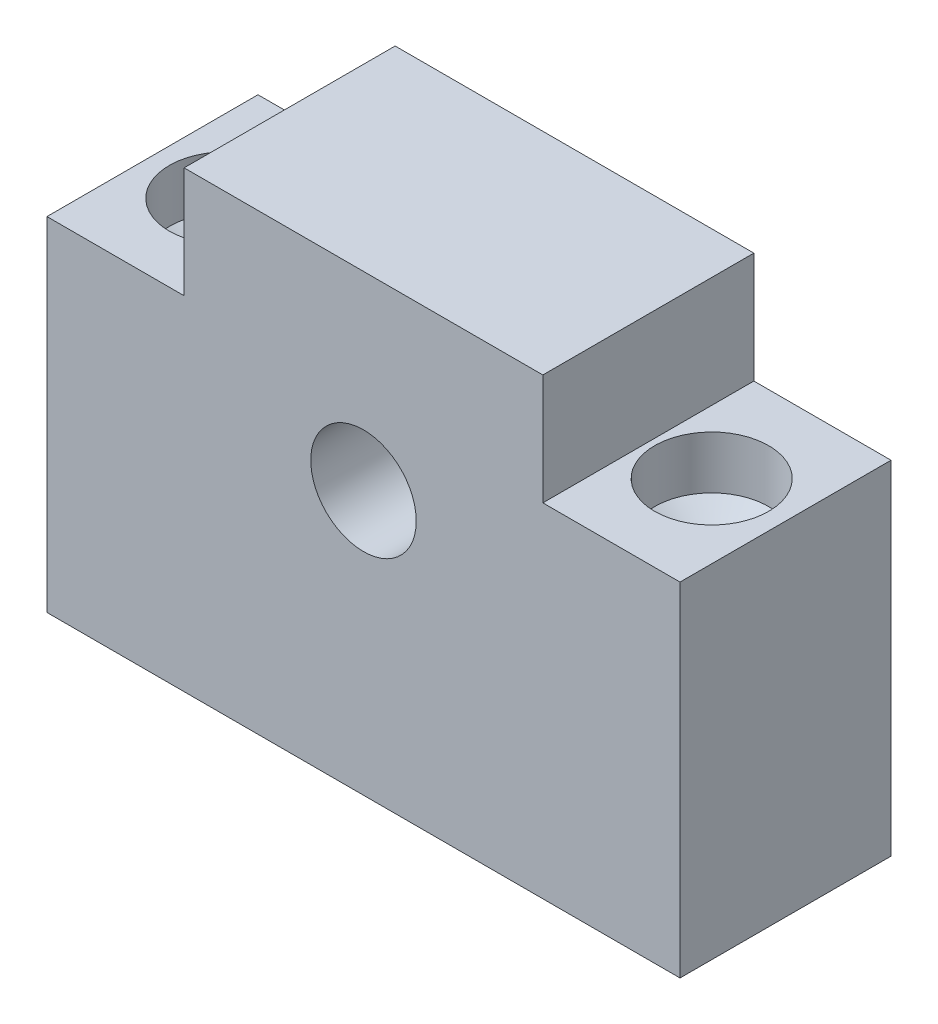
ISO-10303-21;
HEADER;
FILE_DESCRIPTION(('STEP AP214'),'2;1');
FILE_NAME('part.step','',(''),(''),'','','');
FILE_SCHEMA(('AUTOMOTIVE_DESIGN { 1 0 10303 214 1 1 1 1 }'));
ENDSEC;
DATA;
#1=APPLICATION_CONTEXT('core data for automotive mechanical design processes');
#2=APPLICATION_PROTOCOL_DEFINITION('international standard','automotive_design',2000,#1);
#3=PRODUCT_CONTEXT('',#1,'mechanical');
#4=PRODUCT('Part','Part','',(#3));
#5=PRODUCT_RELATED_PRODUCT_CATEGORY('part','',(#4));
#6=PRODUCT_DEFINITION_FORMATION('','',#4);
#7=PRODUCT_DEFINITION_CONTEXT('part definition',#1,'design');
#8=PRODUCT_DEFINITION('design','',#6,#7);
#9=PRODUCT_DEFINITION_SHAPE('','',#8);
#10=(LENGTH_UNIT() NAMED_UNIT(*) SI_UNIT(.MILLI.,.METRE.));
#11=(NAMED_UNIT(*) PLANE_ANGLE_UNIT() SI_UNIT($,.RADIAN.));
#12=(NAMED_UNIT(*) SI_UNIT($,.STERADIAN.) SOLID_ANGLE_UNIT());
#13=UNCERTAINTY_MEASURE_WITH_UNIT(LENGTH_MEASURE(1.E-05),#10,'distance_accuracy_value','');
#14=(GEOMETRIC_REPRESENTATION_CONTEXT(3) GLOBAL_UNCERTAINTY_ASSIGNED_CONTEXT((#13)) GLOBAL_UNIT_ASSIGNED_CONTEXT((#10,
#11,#12)) REPRESENTATION_CONTEXT('',''));
#15=CARTESIAN_POINT('',(0.,0.,0.));
#16=DIRECTION('',(0.,0.,1.));
#17=DIRECTION('',(1.,0.,0.));
#18=AXIS2_PLACEMENT_3D('',#15,#16,#17);
#19=CARTESIAN_POINT('',(30.,16.25,20.));
#20=DIRECTION('',(-1.,0.,0.));
#21=DIRECTION('',(0.,-1.,0.));
#22=AXIS2_PLACEMENT_3D('',#19,#20,#21);
#23=PLANE('',#22);
#24=DIRECTION('',(0.,1.,0.));
#25=VECTOR('',#24,1.);
#26=CARTESIAN_POINT('',(30.,16.25,0.));
#27=LINE('',#26,#25);
#28=CARTESIAN_POINT('',(30.,-16.25,0.));
#29=VERTEX_POINT('',#28);
#30=CARTESIAN_POINT('',(30.,16.25,0.));
#31=VERTEX_POINT('',#30);
#32=EDGE_CURVE('E129',#29,#31,#27,.T.);
#33=ORIENTED_EDGE('',*,*,#32,.T.);
#34=DIRECTION('',(0.,0.,-1.));
#35=VECTOR('',#34,1.);
#36=CARTESIAN_POINT('',(30.,16.25,20.));
#37=LINE('',#36,#35);
#38=CARTESIAN_POINT('',(30.,16.25,20.));
#39=VERTEX_POINT('',#38);
#40=EDGE_CURVE('E11',#39,#31,#37,.T.);
#41=ORIENTED_EDGE('',*,*,#40,.F.);
#42=DIRECTION('',(0.,1.,0.));
#43=VECTOR('',#42,1.);
#44=CARTESIAN_POINT('',(30.,16.25,20.));
#45=LINE('',#44,#43);
#46=CARTESIAN_POINT('',(30.,-16.25,20.));
#47=VERTEX_POINT('',#46);
#48=EDGE_CURVE('E144',#47,#39,#45,.T.);
#49=ORIENTED_EDGE('',*,*,#48,.F.);
#50=DIRECTION('',(0.,0.,-1.));
#51=VECTOR('',#50,1.);
#52=CARTESIAN_POINT('',(30.,-16.25,20.));
#53=LINE('',#52,#51);
#54=EDGE_CURVE('E125',#47,#29,#53,.T.);
#55=ORIENTED_EDGE('',*,*,#54,.T.);
#56=EDGE_LOOP('',(#33,#41,#49,#55));
#57=FACE_BOUND('',#56,.T.);
#58=ADVANCED_FACE('F32',(#57),#23,.F.);
#59=CARTESIAN_POINT('',(17.,16.25,20.));
#60=DIRECTION('',(0.,-1.,0.));
#61=DIRECTION('',(0.,0.,-1.));
#62=AXIS2_PLACEMENT_3D('',#59,#60,#61);
#63=PLANE('',#62);
#64=CARTESIAN_POINT('',(23.,16.25,10.));
#65=DIRECTION('',(0.,1.,0.));
#66=DIRECTION('',(0.,0.,1.));
#67=AXIS2_PLACEMENT_3D('',#64,#65,#66);
#68=CIRCLE('',#67,5.39999999999999);
#69=CARTESIAN_POINT('',(23.,16.25,15.4));
#70=VERTEX_POINT('',#69);
#71=EDGE_CURVE('E192',#70,#70,#68,.T.);
#72=ORIENTED_EDGE('',*,*,#71,.F.);
#73=EDGE_LOOP('',(#72));
#74=FACE_BOUND('',#73,.T.);
#75=DIRECTION('',(-1.,0.,0.));
#76=VECTOR('',#75,1.);
#77=CARTESIAN_POINT('',(17.,16.25,0.));
#78=LINE('',#77,#76);
#79=CARTESIAN_POINT('',(17.,16.25,0.));
#80=VERTEX_POINT('',#79);
#81=EDGE_CURVE('E132',#31,#80,#78,.T.);
#82=ORIENTED_EDGE('',*,*,#81,.T.);
#83=DIRECTION('',(0.,0.,-1.));
#84=VECTOR('',#83,1.);
#85=CARTESIAN_POINT('',(17.,16.25,20.));
#86=LINE('',#85,#84);
#87=CARTESIAN_POINT('',(17.,16.25,20.));
#88=VERTEX_POINT('',#87);
#89=EDGE_CURVE('E41',#88,#80,#86,.T.);
#90=ORIENTED_EDGE('',*,*,#89,.F.);
#91=DIRECTION('',(-1.,0.,0.));
#92=VECTOR('',#91,1.);
#93=CARTESIAN_POINT('',(17.,16.25,20.));
#94=LINE('',#93,#92);
#95=EDGE_CURVE('E92',#39,#88,#94,.T.);
#96=ORIENTED_EDGE('',*,*,#95,.F.);
#97=ORIENTED_EDGE('',*,*,#40,.T.);
#98=EDGE_LOOP('',(#82,#90,#96,#97));
#99=FACE_BOUND('',#98,.T.);
#100=ADVANCED_FACE('F243',(#74,#99),#63,.F.);
#101=CARTESIAN_POINT('',(17.,26.75,20.));
#102=DIRECTION('',(-1.,0.,0.));
#103=DIRECTION('',(0.,0.,1.));
#104=AXIS2_PLACEMENT_3D('',#101,#102,#103);
#105=PLANE('',#104);
#106=DIRECTION('',(0.,1.,0.));
#107=VECTOR('',#106,1.);
#108=CARTESIAN_POINT('',(17.,26.75,0.));
#109=LINE('',#108,#107);
#110=CARTESIAN_POINT('',(17.,26.75,0.));
#111=VERTEX_POINT('',#110);
#112=EDGE_CURVE('E135',#80,#111,#109,.T.);
#113=ORIENTED_EDGE('',*,*,#112,.T.);
#114=DIRECTION('',(0.,0.,-1.));
#115=VECTOR('',#114,1.);
#116=CARTESIAN_POINT('',(17.,26.75,20.));
#117=LINE('',#116,#115);
#118=CARTESIAN_POINT('',(17.,26.75,20.));
#119=VERTEX_POINT('',#118);
#120=EDGE_CURVE('E151',#119,#111,#117,.T.);
#121=ORIENTED_EDGE('',*,*,#120,.F.);
#122=DIRECTION('',(0.,1.,0.));
#123=VECTOR('',#122,1.);
#124=CARTESIAN_POINT('',(17.,26.75,20.));
#125=LINE('',#124,#123);
#126=EDGE_CURVE('E160',#88,#119,#125,.T.);
#127=ORIENTED_EDGE('',*,*,#126,.F.);
#128=ORIENTED_EDGE('',*,*,#89,.T.);
#129=EDGE_LOOP('',(#113,#121,#127,#128));
#130=FACE_BOUND('',#129,.T.);
#131=ADVANCED_FACE('F158',(#130),#105,.F.);
#132=CARTESIAN_POINT('',(-17.,26.75,20.));
#133=DIRECTION('',(0.,-1.,0.));
#134=DIRECTION('',(0.,0.,-1.));
#135=AXIS2_PLACEMENT_3D('',#132,#133,#134);
#136=PLANE('',#135);
#137=DIRECTION('',(-1.,0.,0.));
#138=VECTOR('',#137,1.);
#139=CARTESIAN_POINT('',(-17.,26.75,0.));
#140=LINE('',#139,#138);
#141=CARTESIAN_POINT('',(-17.,26.75,0.));
#142=VERTEX_POINT('',#141);
#143=EDGE_CURVE('E137',#111,#142,#140,.T.);
#144=ORIENTED_EDGE('',*,*,#143,.T.);
#145=DIRECTION('',(0.,0.,-1.));
#146=VECTOR('',#145,1.);
#147=CARTESIAN_POINT('',(-17.,26.75,20.));
#148=LINE('',#147,#146);
#149=CARTESIAN_POINT('',(-17.,26.75,20.));
#150=VERTEX_POINT('',#149);
#151=EDGE_CURVE('E148',#150,#142,#148,.T.);
#152=ORIENTED_EDGE('',*,*,#151,.F.);
#153=DIRECTION('',(-1.,0.,0.));
#154=VECTOR('',#153,1.);
#155=CARTESIAN_POINT('',(-17.,26.75,20.));
#156=LINE('',#155,#154);
#157=EDGE_CURVE('E172',#119,#150,#156,.T.);
#158=ORIENTED_EDGE('',*,*,#157,.F.);
#159=ORIENTED_EDGE('',*,*,#120,.T.);
#160=EDGE_LOOP('',(#144,#152,#158,#159));
#161=FACE_BOUND('',#160,.T.);
#162=ADVANCED_FACE('F168',(#161),#136,.F.);
#163=CARTESIAN_POINT('',(-17.,16.25,20.));
#164=DIRECTION('',(1.,0.,0.));
#165=DIRECTION('',(0.,0.,-1.));
#166=AXIS2_PLACEMENT_3D('',#163,#164,#165);
#167=PLANE('',#166);
#168=DIRECTION('',(0.,-1.,0.));
#169=VECTOR('',#168,1.);
#170=CARTESIAN_POINT('',(-17.,16.25,0.));
#171=LINE('',#170,#169);
#172=CARTESIAN_POINT('',(-17.,16.25,0.));
#173=VERTEX_POINT('',#172);
#174=EDGE_CURVE('E139',#142,#173,#171,.T.);
#175=ORIENTED_EDGE('',*,*,#174,.T.);
#176=DIRECTION('',(0.,0.,-1.));
#177=VECTOR('',#176,1.);
#178=CARTESIAN_POINT('',(-17.,16.25,20.));
#179=LINE('',#178,#177);
#180=CARTESIAN_POINT('',(-17.,16.25,20.));
#181=VERTEX_POINT('',#180);
#182=EDGE_CURVE('E120',#181,#173,#179,.T.);
#183=ORIENTED_EDGE('',*,*,#182,.F.);
#184=DIRECTION('',(0.,-1.,0.));
#185=VECTOR('',#184,1.);
#186=CARTESIAN_POINT('',(-17.,16.25,20.));
#187=LINE('',#186,#185);
#188=EDGE_CURVE('E111',#150,#181,#187,.T.);
#189=ORIENTED_EDGE('',*,*,#188,.F.);
#190=ORIENTED_EDGE('',*,*,#151,.T.);
#191=EDGE_LOOP('',(#175,#183,#189,#190));
#192=FACE_BOUND('',#191,.T.);
#193=ADVANCED_FACE('F171',(#192),#167,.F.);
#194=CARTESIAN_POINT('',(-30.,16.25,20.));
#195=DIRECTION('',(0.,-1.,0.));
#196=DIRECTION('',(0.,0.,-1.));
#197=AXIS2_PLACEMENT_3D('',#194,#195,#196);
#198=PLANE('',#197);
#199=CARTESIAN_POINT('',(-23.,16.25,10.));
#200=DIRECTION('',(0.,1.,0.));
#201=DIRECTION('',(0.,0.,1.));
#202=AXIS2_PLACEMENT_3D('',#199,#200,#201);
#203=CIRCLE('',#202,5.39999999999999);
#204=CARTESIAN_POINT('',(-23.,16.25,15.4));
#205=VERTEX_POINT('',#204);
#206=EDGE_CURVE('E198',#205,#205,#203,.T.);
#207=ORIENTED_EDGE('',*,*,#206,.F.);
#208=EDGE_LOOP('',(#207));
#209=FACE_BOUND('',#208,.T.);
#210=DIRECTION('',(-1.,0.,0.));
#211=VECTOR('',#210,1.);
#212=CARTESIAN_POINT('',(-30.,16.25,0.));
#213=LINE('',#212,#211);
#214=CARTESIAN_POINT('',(-30.,16.25,0.));
#215=VERTEX_POINT('',#214);
#216=EDGE_CURVE('E119',#173,#215,#213,.T.);
#217=ORIENTED_EDGE('',*,*,#216,.T.);
#218=DIRECTION('',(0.,0.,-1.));
#219=VECTOR('',#218,1.);
#220=CARTESIAN_POINT('',(-30.,16.25,20.));
#221=LINE('',#220,#219);
#222=CARTESIAN_POINT('',(-30.,16.25,20.));
#223=VERTEX_POINT('',#222);
#224=EDGE_CURVE('E116',#223,#215,#221,.T.);
#225=ORIENTED_EDGE('',*,*,#224,.F.);
#226=DIRECTION('',(-1.,0.,0.));
#227=VECTOR('',#226,1.);
#228=CARTESIAN_POINT('',(-30.,16.25,20.));
#229=LINE('',#228,#227);
#230=EDGE_CURVE('E105',#181,#223,#229,.T.);
#231=ORIENTED_EDGE('',*,*,#230,.F.);
#232=ORIENTED_EDGE('',*,*,#182,.T.);
#233=EDGE_LOOP('',(#217,#225,#231,#232));
#234=FACE_BOUND('',#233,.T.);
#235=ADVANCED_FACE('F117',(#209,#234),#198,.F.);
#236=CARTESIAN_POINT('',(-30.,16.25,20.));
#237=DIRECTION('',(1.,0.,0.));
#238=DIRECTION('',(0.,1.,0.));
#239=AXIS2_PLACEMENT_3D('',#236,#237,#238);
#240=PLANE('',#239);
#241=DIRECTION('',(0.,-1.,0.));
#242=VECTOR('',#241,1.);
#243=CARTESIAN_POINT('',(-30.,16.25,0.));
#244=LINE('',#243,#242);
#245=CARTESIAN_POINT('',(-30.,-16.25,0.));
#246=VERTEX_POINT('',#245);
#247=EDGE_CURVE('E78',#215,#246,#244,.T.);
#248=ORIENTED_EDGE('',*,*,#247,.T.);
#249=DIRECTION('',(0.,0.,-1.));
#250=VECTOR('',#249,1.);
#251=CARTESIAN_POINT('',(-30.,-16.25,20.));
#252=LINE('',#251,#250);
#253=CARTESIAN_POINT('',(-30.,-16.25,20.));
#254=VERTEX_POINT('',#253);
#255=EDGE_CURVE('E121',#254,#246,#252,.T.);
#256=ORIENTED_EDGE('',*,*,#255,.F.);
#257=DIRECTION('',(0.,-1.,0.));
#258=VECTOR('',#257,1.);
#259=CARTESIAN_POINT('',(-30.,16.25,20.));
#260=LINE('',#259,#258);
#261=EDGE_CURVE('E109',#223,#254,#260,.T.);
#262=ORIENTED_EDGE('',*,*,#261,.F.);
#263=ORIENTED_EDGE('',*,*,#224,.T.);
#264=EDGE_LOOP('',(#248,#256,#262,#263));
#265=FACE_BOUND('',#264,.T.);
#266=ADVANCED_FACE('F123',(#265),#240,.F.);
#267=CARTESIAN_POINT('',(-30.,-16.25,20.));
#268=DIRECTION('',(0.,1.,0.));
#269=DIRECTION('',(0.,0.,1.));
#270=AXIS2_PLACEMENT_3D('',#267,#268,#269);
#271=PLANE('',#270);
#272=CARTESIAN_POINT('',(-23.,-16.25,10.));
#273=DIRECTION('',(0.,1.,0.));
#274=DIRECTION('',(0.,0.,1.));
#275=AXIS2_PLACEMENT_3D('',#272,#273,#274);
#276=CIRCLE('',#275,3.3);
#277=CARTESIAN_POINT('',(-23.,-16.25,13.3));
#278=VERTEX_POINT('',#277);
#279=EDGE_CURVE('E207',#278,#278,#276,.T.);
#280=ORIENTED_EDGE('',*,*,#279,.T.);
#281=EDGE_LOOP('',(#280));
#282=FACE_BOUND('',#281,.T.);
#283=CARTESIAN_POINT('',(23.,-16.25,10.));
#284=DIRECTION('',(0.,1.,0.));
#285=DIRECTION('',(0.,0.,1.));
#286=AXIS2_PLACEMENT_3D('',#283,#284,#285);
#287=CIRCLE('',#286,3.3);
#288=CARTESIAN_POINT('',(23.,-16.25,13.3));
#289=VERTEX_POINT('',#288);
#290=EDGE_CURVE('E201',#289,#289,#287,.T.);
#291=ORIENTED_EDGE('',*,*,#290,.T.);
#292=EDGE_LOOP('',(#291));
#293=FACE_BOUND('',#292,.T.);
#294=DIRECTION('',(1.,0.,0.));
#295=VECTOR('',#294,1.);
#296=CARTESIAN_POINT('',(-30.,-16.25,0.));
#297=LINE('',#296,#295);
#298=EDGE_CURVE('E84',#246,#29,#297,.T.);
#299=ORIENTED_EDGE('',*,*,#298,.T.);
#300=ORIENTED_EDGE('',*,*,#54,.F.);
#301=DIRECTION('',(1.,0.,0.));
#302=VECTOR('',#301,1.);
#303=CARTESIAN_POINT('',(-30.,-16.25,20.));
#304=LINE('',#303,#302);
#305=EDGE_CURVE('E49',#254,#47,#304,.T.);
#306=ORIENTED_EDGE('',*,*,#305,.F.);
#307=ORIENTED_EDGE('',*,*,#255,.T.);
#308=EDGE_LOOP('',(#299,#300,#306,#307));
#309=FACE_BOUND('',#308,.T.);
#310=ADVANCED_FACE('F211',(#282,#293,#309),#271,.F.);
#311=CARTESIAN_POINT('',(0.,0.,20.));
#312=DIRECTION('',(0.,0.,1.));
#313=DIRECTION('',(1.,0.,0.));
#314=AXIS2_PLACEMENT_3D('',#311,#312,#313);
#315=PLANE('',#314);
#316=CARTESIAN_POINT('',(0.,8.75,20.));
#317=DIRECTION('',(0.,0.,1.));
#318=DIRECTION('',(1.,0.,0.));
#319=AXIS2_PLACEMENT_3D('',#316,#317,#318);
#320=CIRCLE('',#319,5.);
#321=CARTESIAN_POINT('',(5.00000000000001,8.75,20.));
#322=VERTEX_POINT('',#321);
#323=EDGE_CURVE('E133',#322,#322,#320,.T.);
#324=ORIENTED_EDGE('',*,*,#323,.F.);
#325=EDGE_LOOP('',(#324));
#326=FACE_BOUND('',#325,.T.);
#327=ORIENTED_EDGE('',*,*,#48,.T.);
#328=ORIENTED_EDGE('',*,*,#95,.T.);
#329=ORIENTED_EDGE('',*,*,#126,.T.);
#330=ORIENTED_EDGE('',*,*,#157,.T.);
#331=ORIENTED_EDGE('',*,*,#188,.T.);
#332=ORIENTED_EDGE('',*,*,#230,.T.);
#333=ORIENTED_EDGE('',*,*,#261,.T.);
#334=ORIENTED_EDGE('',*,*,#305,.T.);
#335=EDGE_LOOP('',(#327,#328,#329,#330,#331,#332,#333,#334));
#336=FACE_BOUND('',#335,.T.);
#337=ADVANCED_FACE('F107',(#326,#336),#315,.T.);
#338=CARTESIAN_POINT('',(0.,0.,0.));
#339=DIRECTION('',(0.,0.,1.));
#340=DIRECTION('',(1.,0.,0.));
#341=AXIS2_PLACEMENT_3D('',#338,#339,#340);
#342=PLANE('',#341);
#343=CARTESIAN_POINT('',(0.,8.75,0.));
#344=DIRECTION('',(0.,0.,-1.));
#345=DIRECTION('',(-1.,0.,0.));
#346=AXIS2_PLACEMENT_3D('',#343,#344,#345);
#347=CIRCLE('',#346,10.);
#348=CARTESIAN_POINT('',(-10.,8.75,0.));
#349=VERTEX_POINT('',#348);
#350=EDGE_CURVE('E184',#349,#349,#347,.T.);
#351=ORIENTED_EDGE('',*,*,#350,.F.);
#352=EDGE_LOOP('',(#351));
#353=FACE_BOUND('',#352,.T.);
#354=ORIENTED_EDGE('',*,*,#32,.F.);
#355=ORIENTED_EDGE('',*,*,#298,.F.);
#356=ORIENTED_EDGE('',*,*,#247,.F.);
#357=ORIENTED_EDGE('',*,*,#216,.F.);
#358=ORIENTED_EDGE('',*,*,#174,.F.);
#359=ORIENTED_EDGE('',*,*,#143,.F.);
#360=ORIENTED_EDGE('',*,*,#112,.F.);
#361=ORIENTED_EDGE('',*,*,#81,.F.);
#362=EDGE_LOOP('',(#354,#355,#356,#357,#358,#359,#360,#361));
#363=FACE_BOUND('',#362,.T.);
#364=ADVANCED_FACE('F164',(#353,#363),#342,.F.);
#365=CARTESIAN_POINT('',(0.,8.75,10.));
#366=DIRECTION('',(0.,0.,1.));
#367=DIRECTION('',(1.,0.,0.));
#368=AXIS2_PLACEMENT_3D('',#365,#366,#367);
#369=CYLINDRICAL_SURFACE('',#368,5.);
#370=CARTESIAN_POINT('',(0.,8.75,10.));
#371=DIRECTION('',(0.,0.,-1.));
#372=DIRECTION('',(-1.,0.,0.));
#373=AXIS2_PLACEMENT_3D('',#370,#371,#372);
#374=CIRCLE('',#373,5.);
#375=CARTESIAN_POINT('',(-4.99999999999999,8.75,10.));
#376=VERTEX_POINT('',#375);
#377=EDGE_CURVE('E180',#376,#376,#374,.F.);
#378=ORIENTED_EDGE('',*,*,#377,.F.);
#379=EDGE_LOOP('',(#378));
#380=FACE_BOUND('',#379,.T.);
#381=ORIENTED_EDGE('',*,*,#323,.T.);
#382=EDGE_LOOP('',(#381));
#383=FACE_BOUND('',#382,.T.);
#384=ADVANCED_FACE('F260',(#380,#383),#369,.F.);
#385=CARTESIAN_POINT('',(0.,8.75,10.));
#386=DIRECTION('',(0.,0.,-1.));
#387=DIRECTION('',(-1.,0.,0.));
#388=AXIS2_PLACEMENT_3D('',#385,#386,#387);
#389=PLANE('',#388);
#390=CARTESIAN_POINT('',(0.,8.75,10.));
#391=DIRECTION('',(0.,0.,-1.));
#392=DIRECTION('',(-1.,0.,0.));
#393=AXIS2_PLACEMENT_3D('',#390,#391,#392);
#394=CIRCLE('',#393,10.);
#395=CARTESIAN_POINT('',(-10.,8.75,10.));
#396=VERTEX_POINT('',#395);
#397=EDGE_CURVE('E183',#396,#396,#394,.T.);
#398=ORIENTED_EDGE('',*,*,#397,.T.);
#399=EDGE_LOOP('',(#398));
#400=FACE_BOUND('',#399,.T.);
#401=ORIENTED_EDGE('',*,*,#377,.T.);
#402=EDGE_LOOP('',(#401));
#403=FACE_BOUND('',#402,.T.);
#404=ADVANCED_FACE('F265',(#400,#403),#389,.T.);
#405=CARTESIAN_POINT('',(0.,8.75,10.));
#406=DIRECTION('',(0.,0.,-1.));
#407=DIRECTION('',(-1.,0.,0.));
#408=AXIS2_PLACEMENT_3D('',#405,#406,#407);
#409=CYLINDRICAL_SURFACE('',#408,10.);
#410=ORIENTED_EDGE('',*,*,#397,.F.);
#411=EDGE_LOOP('',(#410));
#412=FACE_BOUND('',#411,.T.);
#413=ORIENTED_EDGE('',*,*,#350,.T.);
#414=EDGE_LOOP('',(#413));
#415=FACE_BOUND('',#414,.T.);
#416=ADVANCED_FACE('F267',(#412,#415),#409,.F.);
#417=CARTESIAN_POINT('',(23.,11.25,10.));
#418=DIRECTION('',(0.,1.,0.));
#419=DIRECTION('',(0.,0.,1.));
#420=AXIS2_PLACEMENT_3D('',#417,#418,#419);
#421=CONICAL_SURFACE('',#420,5.4,1.02974425867665);
#422=CARTESIAN_POINT('',(23.,9.98819270004212,10.));
#423=DIRECTION('',(0.,1.,0.));
#424=DIRECTION('',(0.,0.,1.));
#425=AXIS2_PLACEMENT_3D('',#422,#423,#424);
#426=CIRCLE('',#425,3.29999999999999);
#427=CARTESIAN_POINT('',(23.,9.98819270004212,13.3));
#428=VERTEX_POINT('',#427);
#429=EDGE_CURVE('E35',#428,#428,#426,.F.);
#430=ORIENTED_EDGE('',*,*,#429,.T.);
#431=EDGE_LOOP('',(#430));
#432=FACE_BOUND('',#431,.T.);
#433=CARTESIAN_POINT('',(23.,11.25,10.));
#434=DIRECTION('',(0.,1.,0.));
#435=DIRECTION('',(0.,0.,1.));
#436=AXIS2_PLACEMENT_3D('',#433,#434,#435);
#437=CIRCLE('',#436,5.4);
#438=CARTESIAN_POINT('',(23.,11.25,15.4));
#439=VERTEX_POINT('',#438);
#440=EDGE_CURVE('E187',#439,#439,#437,.T.);
#441=ORIENTED_EDGE('',*,*,#440,.T.);
#442=EDGE_LOOP('',(#441));
#443=FACE_BOUND('',#442,.T.);
#444=ADVANCED_FACE('F270',(#432,#443),#421,.F.);
#445=CARTESIAN_POINT('',(23.,16.25,10.));
#446=DIRECTION('',(0.,1.,0.));
#447=DIRECTION('',(0.,0.,1.));
#448=AXIS2_PLACEMENT_3D('',#445,#446,#447);
#449=CYLINDRICAL_SURFACE('',#448,5.39999999999999);
#450=ORIENTED_EDGE('',*,*,#440,.F.);
#451=EDGE_LOOP('',(#450));
#452=FACE_BOUND('',#451,.T.);
#453=ORIENTED_EDGE('',*,*,#71,.T.);
#454=EDGE_LOOP('',(#453));
#455=FACE_BOUND('',#454,.T.);
#456=ADVANCED_FACE('F225',(#452,#455),#449,.F.);
#457=CARTESIAN_POINT('',(-23.,11.25,10.));
#458=DIRECTION('',(0.,1.,0.));
#459=DIRECTION('',(0.,0.,1.));
#460=AXIS2_PLACEMENT_3D('',#457,#458,#459);
#461=CONICAL_SURFACE('',#460,5.4,1.02974425867665);
#462=CARTESIAN_POINT('',(-23.,9.98819270004212,10.));
#463=DIRECTION('',(0.,1.,0.));
#464=DIRECTION('',(0.,0.,1.));
#465=AXIS2_PLACEMENT_3D('',#462,#463,#464);
#466=CIRCLE('',#465,3.29999999999999);
#467=CARTESIAN_POINT('',(-23.,9.98819270004212,13.3));
#468=VERTEX_POINT('',#467);
#469=EDGE_CURVE('E204',#468,#468,#466,.F.);
#470=ORIENTED_EDGE('',*,*,#469,.T.);
#471=EDGE_LOOP('',(#470));
#472=FACE_BOUND('',#471,.T.);
#473=CARTESIAN_POINT('',(-23.,11.25,10.));
#474=DIRECTION('',(0.,1.,0.));
#475=DIRECTION('',(0.,0.,1.));
#476=AXIS2_PLACEMENT_3D('',#473,#474,#475);
#477=CIRCLE('',#476,5.4);
#478=CARTESIAN_POINT('',(-23.,11.25,15.4));
#479=VERTEX_POINT('',#478);
#480=EDGE_CURVE('E195',#479,#479,#477,.T.);
#481=ORIENTED_EDGE('',*,*,#480,.T.);
#482=EDGE_LOOP('',(#481));
#483=FACE_BOUND('',#482,.T.);
#484=ADVANCED_FACE('F221',(#472,#483),#461,.F.);
#485=CARTESIAN_POINT('',(-23.,16.25,10.));
#486=DIRECTION('',(0.,1.,0.));
#487=DIRECTION('',(0.,0.,1.));
#488=AXIS2_PLACEMENT_3D('',#485,#486,#487);
#489=CYLINDRICAL_SURFACE('',#488,5.39999999999999);
#490=ORIENTED_EDGE('',*,*,#480,.F.);
#491=EDGE_LOOP('',(#490));
#492=FACE_BOUND('',#491,.T.);
#493=ORIENTED_EDGE('',*,*,#206,.T.);
#494=EDGE_LOOP('',(#493));
#495=FACE_BOUND('',#494,.T.);
#496=ADVANCED_FACE('F224',(#492,#495),#489,.F.);
#497=CARTESIAN_POINT('',(23.,16.25,10.));
#498=DIRECTION('',(0.,1.,0.));
#499=DIRECTION('',(0.,0.,1.));
#500=AXIS2_PLACEMENT_3D('',#497,#498,#499);
#501=CYLINDRICAL_SURFACE('',#500,3.29999999999999);
#502=ORIENTED_EDGE('',*,*,#290,.F.);
#503=EDGE_LOOP('',(#502));
#504=FACE_BOUND('',#503,.T.);
#505=ORIENTED_EDGE('',*,*,#429,.F.);
#506=EDGE_LOOP('',(#505));
#507=FACE_BOUND('',#506,.T.);
#508=ADVANCED_FACE('F217',(#504,#507),#501,.F.);
#509=CARTESIAN_POINT('',(-23.,16.25,10.));
#510=DIRECTION('',(0.,1.,0.));
#511=DIRECTION('',(0.,0.,1.));
#512=AXIS2_PLACEMENT_3D('',#509,#510,#511);
#513=CYLINDRICAL_SURFACE('',#512,3.29999999999999);
#514=ORIENTED_EDGE('',*,*,#279,.F.);
#515=EDGE_LOOP('',(#514));
#516=FACE_BOUND('',#515,.T.);
#517=ORIENTED_EDGE('',*,*,#469,.F.);
#518=EDGE_LOOP('',(#517));
#519=FACE_BOUND('',#518,.T.);
#520=ADVANCED_FACE('F214',(#516,#519),#513,.F.);
#521=CLOSED_SHELL('',(#58,#100,#131,#162,#193,#235,#266,#310,#337,#364,#384,#404,#416,#444,#456,
#484,#496,#508,#520));
#522=MANIFOLD_SOLID_BREP('B2',#521);
#523=ADVANCED_BREP_SHAPE_REPRESENTATION('',(#18,#522),#14);
#524=SHAPE_DEFINITION_REPRESENTATION(#9,#523);
ENDSEC;
END-ISO-10303-21;
